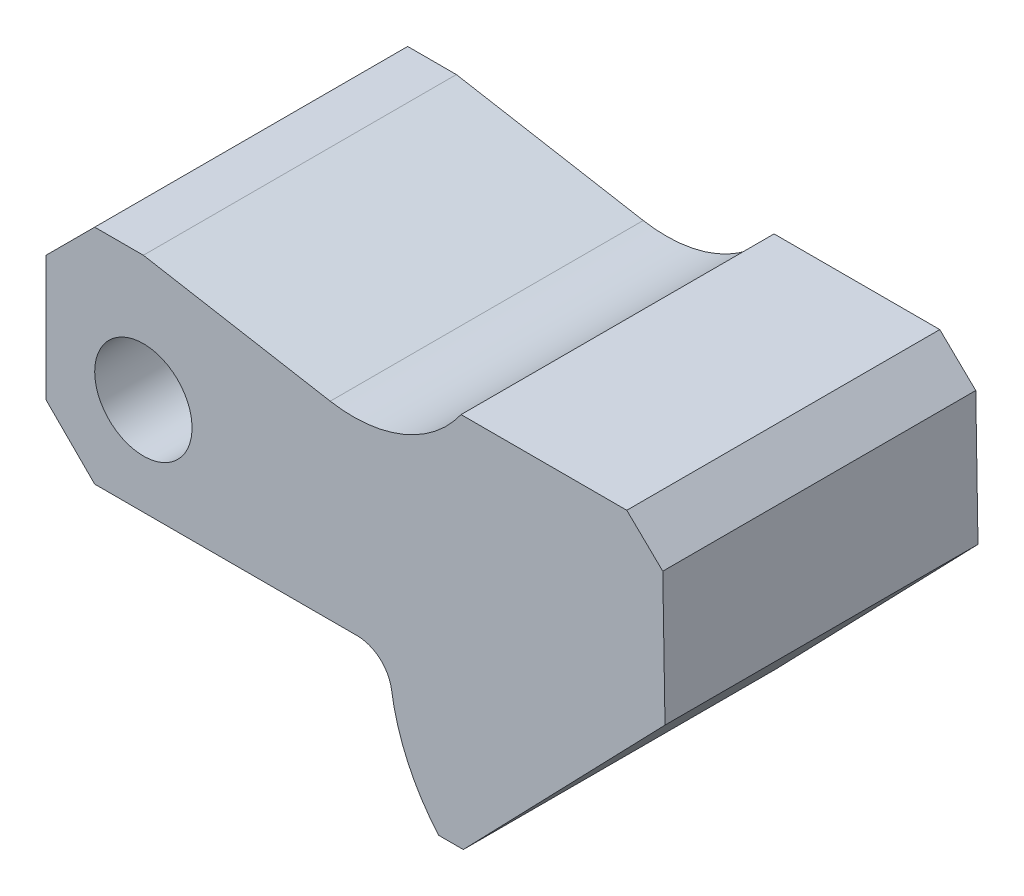
ISO-10303-21;
HEADER;
FILE_DESCRIPTION(('STEP AP214'),'2;1');
FILE_NAME('part.step','',(''),(''),'','','');
FILE_SCHEMA(('AUTOMOTIVE_DESIGN { 1 0 10303 214 1 1 1 1 }'));
ENDSEC;
DATA;
#1=APPLICATION_CONTEXT('core data for automotive mechanical design processes');
#2=APPLICATION_PROTOCOL_DEFINITION('international standard','automotive_design',2000,#1);
#3=PRODUCT_CONTEXT('',#1,'mechanical');
#4=PRODUCT('Part','Part','',(#3));
#5=PRODUCT_RELATED_PRODUCT_CATEGORY('part','',(#4));
#6=PRODUCT_DEFINITION_FORMATION('','',#4);
#7=PRODUCT_DEFINITION_CONTEXT('part definition',#1,'design');
#8=PRODUCT_DEFINITION('design','',#6,#7);
#9=PRODUCT_DEFINITION_SHAPE('','',#8);
#10=(LENGTH_UNIT() NAMED_UNIT(*) SI_UNIT(.MILLI.,.METRE.));
#11=(NAMED_UNIT(*) PLANE_ANGLE_UNIT() SI_UNIT($,.RADIAN.));
#12=(NAMED_UNIT(*) SI_UNIT($,.STERADIAN.) SOLID_ANGLE_UNIT());
#13=UNCERTAINTY_MEASURE_WITH_UNIT(LENGTH_MEASURE(1.E-05),#10,'distance_accuracy_value','');
#14=(GEOMETRIC_REPRESENTATION_CONTEXT(3) GLOBAL_UNCERTAINTY_ASSIGNED_CONTEXT((#13)) GLOBAL_UNIT_ASSIGNED_CONTEXT((#10,
#11,#12)) REPRESENTATION_CONTEXT('',''));
#15=CARTESIAN_POINT('',(0.,0.,0.));
#16=DIRECTION('',(0.,0.,1.));
#17=DIRECTION('',(1.,0.,0.));
#18=AXIS2_PLACEMENT_3D('',#15,#16,#17);
#19=CARTESIAN_POINT('',(37.7363232250662,-5.,45.));
#20=DIRECTION('',(0.,0.,1.));
#21=DIRECTION('',(1.,0.,0.));
#22=AXIS2_PLACEMENT_3D('',#19,#20,#21);
#23=PLANE('',#22);
#24=DIRECTION('',(1.,0.,0.));
#25=VECTOR('',#24,1.);
#26=CARTESIAN_POINT('',(0.,0.,45.));
#27=LINE('',#26,#25);
#28=CARTESIAN_POINT('',(0.,0.,45.));
#29=VERTEX_POINT('',#28);
#30=CARTESIAN_POINT('',(37.7363232250662,0.,45.));
#31=VERTEX_POINT('',#30);
#32=EDGE_CURVE('E222',#29,#31,#27,.T.);
#33=ORIENTED_EDGE('',*,*,#32,.T.);
#34=CARTESIAN_POINT('',(37.7363232250662,-5.,45.));
#35=DIRECTION('',(0.,0.,-1.));
#36=DIRECTION('',(1.,0.,0.));
#37=AXIS2_PLACEMENT_3D('',#34,#35,#36);
#38=CIRCLE('',#37,5.);
#39=CARTESIAN_POINT('',(42.681961966478,-4.26470588235293,45.));
#40=VERTEX_POINT('',#39);
#41=EDGE_CURVE('E122',#31,#40,#38,.T.);
#42=ORIENTED_EDGE('',*,*,#41,.T.);
#43=CARTESIAN_POINT('',(71.3666666666666,0.,45.));
#44=DIRECTION('',(0.,0.,1.));
#45=DIRECTION('',(1.,0.,0.));
#46=AXIS2_PLACEMENT_3D('',#43,#44,#45);
#47=CIRCLE('',#46,29.);
#48=CARTESIAN_POINT('',(49.45776436646,-19.,45.));
#49=VERTEX_POINT('',#48);
#50=EDGE_CURVE('E267',#40,#49,#47,.T.);
#51=ORIENTED_EDGE('',*,*,#50,.T.);
#52=DIRECTION('',(1.,0.,0.));
#53=VECTOR('',#52,1.);
#54=CARTESIAN_POINT('',(49.45776436646,-19.,45.));
#55=LINE('',#54,#53);
#56=CARTESIAN_POINT('',(53.,-19.,45.));
#57=VERTEX_POINT('',#56);
#58=EDGE_CURVE('E287',#49,#57,#55,.T.);
#59=ORIENTED_EDGE('',*,*,#58,.T.);
#60=DIRECTION('',(0.695022096847475,0.718988376049112,0.));
#61=VECTOR('',#60,1.);
#62=CARTESIAN_POINT('',(53.,-19.,45.));
#63=LINE('',#62,#61);
#64=CARTESIAN_POINT('',(82.,11.,45.));
#65=VERTEX_POINT('',#64);
#66=EDGE_CURVE('E283',#57,#65,#63,.T.);
#67=ORIENTED_EDGE('',*,*,#66,.T.);
#68=DIRECTION('',(-0.0169467185432905,0.999856394053973,0.));
#69=VECTOR('',#68,1.);
#70=CARTESIAN_POINT('',(82.,11.,45.));
#71=LINE('',#70,#69);
#72=CARTESIAN_POINT('',(81.6779661016948,30.,45.));
#73=VERTEX_POINT('',#72);
#74=EDGE_CURVE('E286',#65,#73,#71,.T.);
#75=ORIENTED_EDGE('',*,*,#74,.T.);
#76=DIRECTION('',(-0.718988376049112,0.695022096847475,0.));
#77=VECTOR('',#76,1.);
#78=CARTESIAN_POINT('',(81.6779661016948,30.,45.));
#79=LINE('',#78,#77);
#80=CARTESIAN_POINT('',(76.5055523085914,35.,45.));
#81=VERTEX_POINT('',#80);
#82=EDGE_CURVE('E291',#73,#81,#79,.T.);
#83=ORIENTED_EDGE('',*,*,#82,.T.);
#84=DIRECTION('',(-1.,0.,0.));
#85=VECTOR('',#84,1.);
#86=CARTESIAN_POINT('',(76.5055523085914,35.,45.));
#87=LINE('',#86,#85);
#88=CARTESIAN_POINT('',(52.6779661016948,35.,45.));
#89=VERTEX_POINT('',#88);
#90=EDGE_CURVE('E298',#81,#89,#87,.T.);
#91=ORIENTED_EDGE('',*,*,#90,.T.);
#92=CARTESIAN_POINT('',(37.1674426421407,45.9737715490447,45.));
#93=DIRECTION('',(0.,0.,-1.));
#94=DIRECTION('',(1.,0.,0.));
#95=AXIS2_PLACEMENT_3D('',#92,#93,#94);
#96=CIRCLE('',#95,19.);
#97=CARTESIAN_POINT('',(33.868127266469,27.2624242418127,45.));
#98=VERTEX_POINT('',#97);
#99=EDGE_CURVE('E301',#89,#98,#96,.T.);
#100=ORIENTED_EDGE('',*,*,#99,.T.);
#101=DIRECTION('',(-0.984807753012208,0.173648177666932,0.));
#102=VECTOR('',#101,1.);
#103=CARTESIAN_POINT('',(6.99999999999997,32.,45.));
#104=LINE('',#103,#102);
#105=CARTESIAN_POINT('',(6.99999999999997,32.,45.));
#106=VERTEX_POINT('',#105);
#107=EDGE_CURVE('E304',#98,#106,#104,.T.);
#108=ORIENTED_EDGE('',*,*,#107,.T.);
#109=DIRECTION('',(-1.,0.,0.));
#110=VECTOR('',#109,1.);
#111=CARTESIAN_POINT('',(0.,32.,45.));
#112=LINE('',#111,#110);
#113=CARTESIAN_POINT('',(0.,32.,45.));
#114=VERTEX_POINT('',#113);
#115=EDGE_CURVE('E159',#106,#114,#112,.T.);
#116=ORIENTED_EDGE('',*,*,#115,.T.);
#117=DIRECTION('',(-0.707106781186546,-0.707106781186549,0.));
#118=VECTOR('',#117,1.);
#119=CARTESIAN_POINT('',(-7.00000000000003,25.,45.));
#120=LINE('',#119,#118);
#121=CARTESIAN_POINT('',(-7.00000000000003,25.,45.));
#122=VERTEX_POINT('',#121);
#123=EDGE_CURVE('E153',#114,#122,#120,.T.);
#124=ORIENTED_EDGE('',*,*,#123,.T.);
#125=DIRECTION('',(0.,-1.,0.));
#126=VECTOR('',#125,1.);
#127=CARTESIAN_POINT('',(-7.00000000000003,7.,45.));
#128=LINE('',#127,#126);
#129=CARTESIAN_POINT('',(-7.00000000000003,7.,45.));
#130=VERTEX_POINT('',#129);
#131=EDGE_CURVE('E157',#122,#130,#128,.T.);
#132=ORIENTED_EDGE('',*,*,#131,.T.);
#133=DIRECTION('',(0.707106781186549,-0.707106781186546,0.));
#134=VECTOR('',#133,1.);
#135=CARTESIAN_POINT('',(0.,0.,45.));
#136=LINE('',#135,#134);
#137=EDGE_CURVE('E61',#130,#29,#136,.T.);
#138=ORIENTED_EDGE('',*,*,#137,.T.);
#139=EDGE_LOOP('',(#33,#42,#51,#59,#67,#75,#83,#91,#100,#108,#116,#124,#132,#138));
#140=FACE_BOUND('',#139,.T.);
#141=CARTESIAN_POINT('',(6.99999999999997,14.,45.));
#142=DIRECTION('',(0.,0.,1.));
#143=DIRECTION('',(1.,0.,0.));
#144=AXIS2_PLACEMENT_3D('',#141,#142,#143);
#145=CIRCLE('',#144,7.);
#146=CARTESIAN_POINT('',(0.,14.,45.));
#147=VERTEX_POINT('',#146);
#148=EDGE_CURVE('E186',#147,#147,#145,.T.);
#149=ORIENTED_EDGE('',*,*,#148,.F.);
#150=EDGE_LOOP('',(#149));
#151=FACE_BOUND('',#150,.T.);
#152=ADVANCED_FACE('F43',(#140,#151),#23,.T.);
#153=CARTESIAN_POINT('',(37.7363232250662,-5.,0.));
#154=DIRECTION('',(0.,0.,1.));
#155=DIRECTION('',(1.,0.,0.));
#156=AXIS2_PLACEMENT_3D('',#153,#154,#155);
#157=PLANE('',#156);
#158=DIRECTION('',(1.,0.,0.));
#159=VECTOR('',#158,1.);
#160=CARTESIAN_POINT('',(0.,0.,0.));
#161=LINE('',#160,#159);
#162=CARTESIAN_POINT('',(0.,0.,0.));
#163=VERTEX_POINT('',#162);
#164=CARTESIAN_POINT('',(37.7363232250662,0.,0.));
#165=VERTEX_POINT('',#164);
#166=EDGE_CURVE('E181',#163,#165,#161,.T.);
#167=ORIENTED_EDGE('',*,*,#166,.F.);
#168=DIRECTION('',(0.707106781186549,-0.707106781186546,0.));
#169=VECTOR('',#168,1.);
#170=CARTESIAN_POINT('',(0.,0.,0.));
#171=LINE('',#170,#169);
#172=CARTESIAN_POINT('',(-7.00000000000003,7.,0.));
#173=VERTEX_POINT('',#172);
#174=EDGE_CURVE('E114',#173,#163,#171,.T.);
#175=ORIENTED_EDGE('',*,*,#174,.F.);
#176=DIRECTION('',(0.,-1.,0.));
#177=VECTOR('',#176,1.);
#178=CARTESIAN_POINT('',(-7.00000000000003,7.,0.));
#179=LINE('',#178,#177);
#180=CARTESIAN_POINT('',(-7.00000000000003,25.,0.));
#181=VERTEX_POINT('',#180);
#182=EDGE_CURVE('E108',#181,#173,#179,.T.);
#183=ORIENTED_EDGE('',*,*,#182,.F.);
#184=DIRECTION('',(-0.707106781186546,-0.707106781186549,0.));
#185=VECTOR('',#184,1.);
#186=CARTESIAN_POINT('',(-7.00000000000003,25.,0.));
#187=LINE('',#186,#185);
#188=CARTESIAN_POINT('',(0.,32.,0.));
#189=VERTEX_POINT('',#188);
#190=EDGE_CURVE('E168',#189,#181,#187,.T.);
#191=ORIENTED_EDGE('',*,*,#190,.F.);
#192=DIRECTION('',(-1.,0.,0.));
#193=VECTOR('',#192,1.);
#194=CARTESIAN_POINT('',(0.,32.,0.));
#195=LINE('',#194,#193);
#196=CARTESIAN_POINT('',(6.99999999999997,32.,0.));
#197=VERTEX_POINT('',#196);
#198=EDGE_CURVE('E213',#197,#189,#195,.T.);
#199=ORIENTED_EDGE('',*,*,#198,.F.);
#200=DIRECTION('',(-0.984807753012208,0.173648177666932,0.));
#201=VECTOR('',#200,1.);
#202=CARTESIAN_POINT('',(6.99999999999997,32.,0.));
#203=LINE('',#202,#201);
#204=CARTESIAN_POINT('',(33.868127266469,27.2624242418127,0.));
#205=VERTEX_POINT('',#204);
#206=EDGE_CURVE('E210',#205,#197,#203,.T.);
#207=ORIENTED_EDGE('',*,*,#206,.F.);
#208=CARTESIAN_POINT('',(37.1674426421407,45.9737715490447,0.));
#209=DIRECTION('',(0.,0.,-1.));
#210=DIRECTION('',(1.,0.,0.));
#211=AXIS2_PLACEMENT_3D('',#208,#209,#210);
#212=CIRCLE('',#211,19.);
#213=CARTESIAN_POINT('',(52.6779661016948,35.,0.));
#214=VERTEX_POINT('',#213);
#215=EDGE_CURVE('E207',#214,#205,#212,.T.);
#216=ORIENTED_EDGE('',*,*,#215,.F.);
#217=DIRECTION('',(-1.,0.,0.));
#218=VECTOR('',#217,1.);
#219=CARTESIAN_POINT('',(76.5055523085914,35.,0.));
#220=LINE('',#219,#218);
#221=CARTESIAN_POINT('',(76.5055523085914,35.,0.));
#222=VERTEX_POINT('',#221);
#223=EDGE_CURVE('E204',#222,#214,#220,.T.);
#224=ORIENTED_EDGE('',*,*,#223,.F.);
#225=DIRECTION('',(-0.718988376049112,0.695022096847475,0.));
#226=VECTOR('',#225,1.);
#227=CARTESIAN_POINT('',(81.6779661016948,30.,0.));
#228=LINE('',#227,#226);
#229=CARTESIAN_POINT('',(81.6779661016948,30.,0.));
#230=VERTEX_POINT('',#229);
#231=EDGE_CURVE('E201',#230,#222,#228,.T.);
#232=ORIENTED_EDGE('',*,*,#231,.F.);
#233=DIRECTION('',(-0.0169467185432905,0.999856394053973,0.));
#234=VECTOR('',#233,1.);
#235=CARTESIAN_POINT('',(82.,11.,0.));
#236=LINE('',#235,#234);
#237=CARTESIAN_POINT('',(82.,11.,0.));
#238=VERTEX_POINT('',#237);
#239=EDGE_CURVE('E198',#238,#230,#236,.T.);
#240=ORIENTED_EDGE('',*,*,#239,.F.);
#241=DIRECTION('',(0.695022096847475,0.718988376049112,0.));
#242=VECTOR('',#241,1.);
#243=CARTESIAN_POINT('',(53.,-19.,0.));
#244=LINE('',#243,#242);
#245=CARTESIAN_POINT('',(53.,-19.,0.));
#246=VERTEX_POINT('',#245);
#247=EDGE_CURVE('E195',#246,#238,#244,.T.);
#248=ORIENTED_EDGE('',*,*,#247,.F.);
#249=DIRECTION('',(1.,0.,0.));
#250=VECTOR('',#249,1.);
#251=CARTESIAN_POINT('',(49.45776436646,-19.,0.));
#252=LINE('',#251,#250);
#253=CARTESIAN_POINT('',(49.45776436646,-19.,0.));
#254=VERTEX_POINT('',#253);
#255=EDGE_CURVE('E192',#254,#246,#252,.T.);
#256=ORIENTED_EDGE('',*,*,#255,.F.);
#257=CARTESIAN_POINT('',(71.3666666666666,0.,0.));
#258=DIRECTION('',(0.,0.,1.));
#259=DIRECTION('',(1.,0.,0.));
#260=AXIS2_PLACEMENT_3D('',#257,#258,#259);
#261=CIRCLE('',#260,29.);
#262=CARTESIAN_POINT('',(42.681961966478,-4.26470588235293,0.));
#263=VERTEX_POINT('',#262);
#264=EDGE_CURVE('E189',#263,#254,#261,.T.);
#265=ORIENTED_EDGE('',*,*,#264,.F.);
#266=CARTESIAN_POINT('',(37.7363232250662,-5.,0.));
#267=DIRECTION('',(0.,0.,-1.));
#268=DIRECTION('',(1.,0.,0.));
#269=AXIS2_PLACEMENT_3D('',#266,#267,#268);
#270=CIRCLE('',#269,5.);
#271=EDGE_CURVE('E185',#165,#263,#270,.T.);
#272=ORIENTED_EDGE('',*,*,#271,.F.);
#273=EDGE_LOOP('',(#167,#175,#183,#191,#199,#207,#216,#224,#232,#240,#248,#256,#265,#272));
#274=FACE_BOUND('',#273,.T.);
#275=CARTESIAN_POINT('',(6.99999999999997,14.,0.));
#276=DIRECTION('',(0.,0.,1.));
#277=DIRECTION('',(1.,0.,0.));
#278=AXIS2_PLACEMENT_3D('',#275,#276,#277);
#279=CIRCLE('',#278,7.);
#280=CARTESIAN_POINT('',(0.,14.,0.));
#281=VERTEX_POINT('',#280);
#282=EDGE_CURVE('E513',#281,#281,#279,.T.);
#283=ORIENTED_EDGE('',*,*,#282,.T.);
#284=EDGE_LOOP('',(#283));
#285=FACE_BOUND('',#284,.T.);
#286=ADVANCED_FACE('F271',(#274,#285),#157,.F.);
#287=CARTESIAN_POINT('',(0.,0.,45.));
#288=DIRECTION('',(0.,1.,0.));
#289=DIRECTION('',(0.,0.,1.));
#290=AXIS2_PLACEMENT_3D('',#287,#288,#289);
#291=PLANE('',#290);
#292=ORIENTED_EDGE('',*,*,#166,.T.);
#293=DIRECTION('',(0.,0.,-1.));
#294=VECTOR('',#293,1.);
#295=CARTESIAN_POINT('',(37.7363232250662,0.,45.));
#296=LINE('',#295,#294);
#297=EDGE_CURVE('E11',#31,#165,#296,.T.);
#298=ORIENTED_EDGE('',*,*,#297,.F.);
#299=ORIENTED_EDGE('',*,*,#32,.F.);
#300=DIRECTION('',(0.,0.,-1.));
#301=VECTOR('',#300,1.);
#302=CARTESIAN_POINT('',(0.,0.,45.));
#303=LINE('',#302,#301);
#304=EDGE_CURVE('E177',#29,#163,#303,.T.);
#305=ORIENTED_EDGE('',*,*,#304,.T.);
#306=EDGE_LOOP('',(#292,#298,#299,#305));
#307=FACE_BOUND('',#306,.T.);
#308=ADVANCED_FACE('F45',(#307),#291,.F.);
#309=CARTESIAN_POINT('',(37.7363232250662,-5.,45.));
#310=DIRECTION('',(0.,0.,-1.));
#311=DIRECTION('',(-1.,0.,0.));
#312=AXIS2_PLACEMENT_3D('',#309,#310,#311);
#313=CYLINDRICAL_SURFACE('',#312,5.);
#314=ORIENTED_EDGE('',*,*,#271,.T.);
#315=DIRECTION('',(0.,0.,-1.));
#316=VECTOR('',#315,1.);
#317=CARTESIAN_POINT('',(42.681961966478,-4.26470588235293,45.));
#318=LINE('',#317,#316);
#319=EDGE_CURVE('E53',#40,#263,#318,.T.);
#320=ORIENTED_EDGE('',*,*,#319,.F.);
#321=ORIENTED_EDGE('',*,*,#41,.F.);
#322=ORIENTED_EDGE('',*,*,#297,.T.);
#323=EDGE_LOOP('',(#314,#320,#321,#322));
#324=FACE_BOUND('',#323,.T.);
#325=ADVANCED_FACE('F340',(#324),#313,.F.);
#326=CARTESIAN_POINT('',(71.3666666666666,0.,45.));
#327=DIRECTION('',(0.,0.,-1.));
#328=DIRECTION('',(-1.,0.,0.));
#329=AXIS2_PLACEMENT_3D('',#326,#327,#328);
#330=CYLINDRICAL_SURFACE('',#329,29.);
#331=ORIENTED_EDGE('',*,*,#264,.T.);
#332=DIRECTION('',(0.,0.,-1.));
#333=VECTOR('',#332,1.);
#334=CARTESIAN_POINT('',(49.45776436646,-19.,45.));
#335=LINE('',#334,#333);
#336=EDGE_CURVE('E257',#49,#254,#335,.T.);
#337=ORIENTED_EDGE('',*,*,#336,.F.);
#338=ORIENTED_EDGE('',*,*,#50,.F.);
#339=ORIENTED_EDGE('',*,*,#319,.T.);
#340=EDGE_LOOP('',(#331,#337,#338,#339));
#341=FACE_BOUND('',#340,.T.);
#342=ADVANCED_FACE('F265',(#341),#330,.T.);
#343=CARTESIAN_POINT('',(49.45776436646,-19.,45.));
#344=DIRECTION('',(0.,1.,0.));
#345=DIRECTION('',(-1.,0.,0.));
#346=AXIS2_PLACEMENT_3D('',#343,#344,#345);
#347=PLANE('',#346);
#348=ORIENTED_EDGE('',*,*,#255,.T.);
#349=DIRECTION('',(0.,0.,-1.));
#350=VECTOR('',#349,1.);
#351=CARTESIAN_POINT('',(53.,-19.,45.));
#352=LINE('',#351,#350);
#353=EDGE_CURVE('E253',#57,#246,#352,.T.);
#354=ORIENTED_EDGE('',*,*,#353,.F.);
#355=ORIENTED_EDGE('',*,*,#58,.F.);
#356=ORIENTED_EDGE('',*,*,#336,.T.);
#357=EDGE_LOOP('',(#348,#354,#355,#356));
#358=FACE_BOUND('',#357,.T.);
#359=ADVANCED_FACE('F277',(#358),#347,.F.);
#360=CARTESIAN_POINT('',(53.,-19.,45.));
#361=DIRECTION('',(-0.718988376049112,0.695022096847475,0.));
#362=DIRECTION('',(-0.695022096847475,-0.718988376049112,0.));
#363=AXIS2_PLACEMENT_3D('',#360,#361,#362);
#364=PLANE('',#363);
#365=ORIENTED_EDGE('',*,*,#247,.T.);
#366=DIRECTION('',(0.,0.,-1.));
#367=VECTOR('',#366,1.);
#368=CARTESIAN_POINT('',(82.,11.,45.));
#369=LINE('',#368,#367);
#370=EDGE_CURVE('E249',#65,#238,#369,.T.);
#371=ORIENTED_EDGE('',*,*,#370,.F.);
#372=ORIENTED_EDGE('',*,*,#66,.F.);
#373=ORIENTED_EDGE('',*,*,#353,.T.);
#374=EDGE_LOOP('',(#365,#371,#372,#373));
#375=FACE_BOUND('',#374,.T.);
#376=ADVANCED_FACE('F281',(#375),#364,.F.);
#377=CARTESIAN_POINT('',(82.,11.,45.));
#378=DIRECTION('',(-0.999856394053973,-0.0169467185432905,0.));
#379=DIRECTION('',(0.0169467185432905,-0.999856394053973,0.));
#380=AXIS2_PLACEMENT_3D('',#377,#378,#379);
#381=PLANE('',#380);
#382=ORIENTED_EDGE('',*,*,#239,.T.);
#383=DIRECTION('',(0.,0.,-1.));
#384=VECTOR('',#383,1.);
#385=CARTESIAN_POINT('',(81.6779661016948,30.,45.));
#386=LINE('',#385,#384);
#387=EDGE_CURVE('E245',#73,#230,#386,.T.);
#388=ORIENTED_EDGE('',*,*,#387,.F.);
#389=ORIENTED_EDGE('',*,*,#74,.F.);
#390=ORIENTED_EDGE('',*,*,#370,.T.);
#391=EDGE_LOOP('',(#382,#388,#389,#390));
#392=FACE_BOUND('',#391,.T.);
#393=ADVANCED_FACE('F353',(#392),#381,.F.);
#394=CARTESIAN_POINT('',(81.6779661016948,30.,45.));
#395=DIRECTION('',(-0.695022096847475,-0.718988376049111,0.));
#396=DIRECTION('',(0.718988376049112,-0.695022096847475,0.));
#397=AXIS2_PLACEMENT_3D('',#394,#395,#396);
#398=PLANE('',#397);
#399=ORIENTED_EDGE('',*,*,#231,.T.);
#400=DIRECTION('',(0.,0.,-1.));
#401=VECTOR('',#400,1.);
#402=CARTESIAN_POINT('',(76.5055523085914,35.,45.));
#403=LINE('',#402,#401);
#404=EDGE_CURVE('E241',#81,#222,#403,.T.);
#405=ORIENTED_EDGE('',*,*,#404,.F.);
#406=ORIENTED_EDGE('',*,*,#82,.F.);
#407=ORIENTED_EDGE('',*,*,#387,.T.);
#408=EDGE_LOOP('',(#399,#405,#406,#407));
#409=FACE_BOUND('',#408,.T.);
#410=ADVANCED_FACE('F356',(#409),#398,.F.);
#411=CARTESIAN_POINT('',(76.5055523085914,35.,45.));
#412=DIRECTION('',(0.,-1.,0.));
#413=DIRECTION('',(0.,0.,-1.));
#414=AXIS2_PLACEMENT_3D('',#411,#412,#413);
#415=PLANE('',#414);
#416=ORIENTED_EDGE('',*,*,#223,.T.);
#417=DIRECTION('',(0.,0.,-1.));
#418=VECTOR('',#417,1.);
#419=CARTESIAN_POINT('',(52.6779661016948,35.,45.));
#420=LINE('',#419,#418);
#421=EDGE_CURVE('E237',#89,#214,#420,.T.);
#422=ORIENTED_EDGE('',*,*,#421,.F.);
#423=ORIENTED_EDGE('',*,*,#90,.F.);
#424=ORIENTED_EDGE('',*,*,#404,.T.);
#425=EDGE_LOOP('',(#416,#422,#423,#424));
#426=FACE_BOUND('',#425,.T.);
#427=ADVANCED_FACE('F360',(#426),#415,.F.);
#428=CARTESIAN_POINT('',(37.1674426421407,45.9737715490447,45.));
#429=DIRECTION('',(0.,0.,-1.));
#430=DIRECTION('',(-1.,0.,0.));
#431=AXIS2_PLACEMENT_3D('',#428,#429,#430);
#432=CYLINDRICAL_SURFACE('',#431,19.);
#433=ORIENTED_EDGE('',*,*,#215,.T.);
#434=DIRECTION('',(0.,0.,-1.));
#435=VECTOR('',#434,1.);
#436=CARTESIAN_POINT('',(33.868127266469,27.2624242418127,45.));
#437=LINE('',#436,#435);
#438=EDGE_CURVE('E233',#98,#205,#437,.T.);
#439=ORIENTED_EDGE('',*,*,#438,.F.);
#440=ORIENTED_EDGE('',*,*,#99,.F.);
#441=ORIENTED_EDGE('',*,*,#421,.T.);
#442=EDGE_LOOP('',(#433,#439,#440,#441));
#443=FACE_BOUND('',#442,.T.);
#444=ADVANCED_FACE('F364',(#443),#432,.F.);
#445=CARTESIAN_POINT('',(6.99999999999997,32.,45.));
#446=DIRECTION('',(-0.173648177666932,-0.984807753012208,0.));
#447=DIRECTION('',(0.984807753012208,-0.173648177666932,0.));
#448=AXIS2_PLACEMENT_3D('',#445,#446,#447);
#449=PLANE('',#448);
#450=ORIENTED_EDGE('',*,*,#206,.T.);
#451=DIRECTION('',(0.,0.,-1.));
#452=VECTOR('',#451,1.);
#453=CARTESIAN_POINT('',(6.99999999999997,32.,45.));
#454=LINE('',#453,#452);
#455=EDGE_CURVE('E229',#106,#197,#454,.T.);
#456=ORIENTED_EDGE('',*,*,#455,.F.);
#457=ORIENTED_EDGE('',*,*,#107,.F.);
#458=ORIENTED_EDGE('',*,*,#438,.T.);
#459=EDGE_LOOP('',(#450,#456,#457,#458));
#460=FACE_BOUND('',#459,.T.);
#461=ADVANCED_FACE('F312',(#460),#449,.F.);
#462=CARTESIAN_POINT('',(0.,32.,45.));
#463=DIRECTION('',(0.,-1.,0.));
#464=DIRECTION('',(1.,0.,0.));
#465=AXIS2_PLACEMENT_3D('',#462,#463,#464);
#466=PLANE('',#465);
#467=ORIENTED_EDGE('',*,*,#198,.T.);
#468=DIRECTION('',(0.,0.,-1.));
#469=VECTOR('',#468,1.);
#470=CARTESIAN_POINT('',(0.,32.,45.));
#471=LINE('',#470,#469);
#472=EDGE_CURVE('E170',#114,#189,#471,.T.);
#473=ORIENTED_EDGE('',*,*,#472,.F.);
#474=ORIENTED_EDGE('',*,*,#115,.F.);
#475=ORIENTED_EDGE('',*,*,#455,.T.);
#476=EDGE_LOOP('',(#467,#473,#474,#475));
#477=FACE_BOUND('',#476,.T.);
#478=ADVANCED_FACE('F316',(#477),#466,.F.);
#479=CARTESIAN_POINT('',(-7.00000000000003,25.,45.));
#480=DIRECTION('',(0.707106781186549,-0.707106781186546,0.));
#481=DIRECTION('',(0.707106781186546,0.707106781186549,0.));
#482=AXIS2_PLACEMENT_3D('',#479,#480,#481);
#483=PLANE('',#482);
#484=ORIENTED_EDGE('',*,*,#190,.T.);
#485=DIRECTION('',(0.,0.,-1.));
#486=VECTOR('',#485,1.);
#487=CARTESIAN_POINT('',(-7.00000000000003,25.,45.));
#488=LINE('',#487,#486);
#489=EDGE_CURVE('E165',#122,#181,#488,.T.);
#490=ORIENTED_EDGE('',*,*,#489,.F.);
#491=ORIENTED_EDGE('',*,*,#123,.F.);
#492=ORIENTED_EDGE('',*,*,#472,.T.);
#493=EDGE_LOOP('',(#484,#490,#491,#492));
#494=FACE_BOUND('',#493,.T.);
#495=ADVANCED_FACE('F166',(#494),#483,.F.);
#496=CARTESIAN_POINT('',(-7.00000000000003,7.,45.));
#497=DIRECTION('',(1.,0.,0.));
#498=DIRECTION('',(0.,0.,-1.));
#499=AXIS2_PLACEMENT_3D('',#496,#497,#498);
#500=PLANE('',#499);
#501=ORIENTED_EDGE('',*,*,#182,.T.);
#502=DIRECTION('',(0.,0.,-1.));
#503=VECTOR('',#502,1.);
#504=CARTESIAN_POINT('',(-7.00000000000003,7.,45.));
#505=LINE('',#504,#503);
#506=EDGE_CURVE('E171',#130,#173,#505,.T.);
#507=ORIENTED_EDGE('',*,*,#506,.F.);
#508=ORIENTED_EDGE('',*,*,#131,.F.);
#509=ORIENTED_EDGE('',*,*,#489,.T.);
#510=EDGE_LOOP('',(#501,#507,#508,#509));
#511=FACE_BOUND('',#510,.T.);
#512=ADVANCED_FACE('F173',(#511),#500,.F.);
#513=CARTESIAN_POINT('',(0.,0.,45.));
#514=DIRECTION('',(0.707106781186546,0.707106781186549,0.));
#515=DIRECTION('',(-0.707106781186549,0.707106781186546,0.));
#516=AXIS2_PLACEMENT_3D('',#513,#514,#515);
#517=PLANE('',#516);
#518=ORIENTED_EDGE('',*,*,#174,.T.);
#519=ORIENTED_EDGE('',*,*,#304,.F.);
#520=ORIENTED_EDGE('',*,*,#137,.F.);
#521=ORIENTED_EDGE('',*,*,#506,.T.);
#522=EDGE_LOOP('',(#518,#519,#520,#521));
#523=FACE_BOUND('',#522,.T.);
#524=ADVANCED_FACE('F320',(#523),#517,.F.);
#525=CARTESIAN_POINT('',(6.99999999999997,14.,45.));
#526=DIRECTION('',(0.,0.,-1.));
#527=DIRECTION('',(-1.,0.,0.));
#528=AXIS2_PLACEMENT_3D('',#525,#526,#527);
#529=CYLINDRICAL_SURFACE('',#528,7.);
#530=CARTESIAN_POINT('',(0.,14.,45.));
#531=CARTESIAN_POINT('',(0.,14.,44.53125));
#532=CARTESIAN_POINT('',(0.,14.,44.0625));
#533=CARTESIAN_POINT('',(0.,14.,43.125));
#534=CARTESIAN_POINT('',(0.,14.,42.65625));
#535=CARTESIAN_POINT('',(0.,14.,41.71875));
#536=CARTESIAN_POINT('',(0.,14.,41.25));
#537=CARTESIAN_POINT('',(0.,14.,40.3125));
#538=CARTESIAN_POINT('',(0.,14.,39.84375));
#539=CARTESIAN_POINT('',(0.,14.,38.90625));
#540=CARTESIAN_POINT('',(0.,14.,38.4375));
#541=CARTESIAN_POINT('',(0.,14.,37.5));
#542=CARTESIAN_POINT('',(0.,14.,37.03125));
#543=CARTESIAN_POINT('',(0.,14.,36.09375));
#544=CARTESIAN_POINT('',(0.,14.,35.625));
#545=CARTESIAN_POINT('',(0.,14.,34.6875));
#546=CARTESIAN_POINT('',(0.,14.,34.21875));
#547=CARTESIAN_POINT('',(0.,14.,33.28125));
#548=CARTESIAN_POINT('',(0.,14.,32.8125));
#549=CARTESIAN_POINT('',(0.,14.,31.875));
#550=CARTESIAN_POINT('',(0.,14.,31.40625));
#551=CARTESIAN_POINT('',(0.,14.,30.46875));
#552=CARTESIAN_POINT('',(0.,14.,30.));
#553=CARTESIAN_POINT('',(0.,14.,29.0625));
#554=CARTESIAN_POINT('',(0.,14.,28.59375));
#555=CARTESIAN_POINT('',(0.,14.,27.65625));
#556=CARTESIAN_POINT('',(0.,14.,27.1875));
#557=CARTESIAN_POINT('',(0.,14.,26.25));
#558=CARTESIAN_POINT('',(0.,14.,25.78125));
#559=CARTESIAN_POINT('',(0.,14.,24.84375));
#560=CARTESIAN_POINT('',(0.,14.,24.375));
#561=CARTESIAN_POINT('',(0.,14.,23.4375));
#562=CARTESIAN_POINT('',(0.,14.,22.96875));
#563=CARTESIAN_POINT('',(0.,14.,22.03125));
#564=CARTESIAN_POINT('',(0.,14.,21.5625));
#565=CARTESIAN_POINT('',(0.,14.,20.625));
#566=CARTESIAN_POINT('',(0.,14.,20.15625));
#567=CARTESIAN_POINT('',(0.,14.,19.21875));
#568=CARTESIAN_POINT('',(0.,14.,18.75));
#569=CARTESIAN_POINT('',(0.,14.,17.8125));
#570=CARTESIAN_POINT('',(0.,14.,17.34375));
#571=CARTESIAN_POINT('',(0.,14.,16.40625));
#572=CARTESIAN_POINT('',(0.,14.,15.9375));
#573=CARTESIAN_POINT('',(0.,14.,15.));
#574=CARTESIAN_POINT('',(0.,14.,14.53125));
#575=CARTESIAN_POINT('',(0.,14.,13.59375));
#576=CARTESIAN_POINT('',(0.,14.,13.125));
#577=CARTESIAN_POINT('',(0.,14.,12.1875));
#578=CARTESIAN_POINT('',(0.,14.,11.71875));
#579=CARTESIAN_POINT('',(0.,14.,10.78125));
#580=CARTESIAN_POINT('',(0.,14.,10.3125));
#581=CARTESIAN_POINT('',(0.,14.,9.375));
#582=CARTESIAN_POINT('',(0.,14.,8.90625));
#583=CARTESIAN_POINT('',(0.,14.,7.96874999999999));
#584=CARTESIAN_POINT('',(0.,14.,7.5));
#585=CARTESIAN_POINT('',(0.,14.,6.5625));
#586=CARTESIAN_POINT('',(0.,14.,6.09375));
#587=CARTESIAN_POINT('',(0.,14.,5.15625));
#588=CARTESIAN_POINT('',(0.,14.,4.68749999999999));
#589=CARTESIAN_POINT('',(0.,14.,3.74999999999999));
#590=CARTESIAN_POINT('',(0.,14.,3.28124999999999));
#591=CARTESIAN_POINT('',(0.,14.,2.34374999999999));
#592=CARTESIAN_POINT('',(0.,14.,1.87499999999999));
#593=CARTESIAN_POINT('',(0.,14.,0.937499999999992));
#594=CARTESIAN_POINT('',(0.,14.,0.468749999999993));
#595=CARTESIAN_POINT('',(0.,14.,0.));
#596=B_SPLINE_CURVE_WITH_KNOTS('',3,(#530,#531,#532,#533,#534,#535,#536,#537,#538,#539,#540,
#541,#542,#543,#544,#545,#546,#547,#548,#549,#550,#551,#552,#553,#554,#555,#556,#557,#558,#559,
#560,#561,#562,#563,#564,#565,#566,#567,#568,#569,#570,#571,#572,#573,#574,#575,#576,#577,#578,
#579,#580,#581,#582,#583,#584,#585,#586,#587,#588,#589,#590,#591,#592,#593,#594,#595),
.UNSPECIFIED.,.F.,.F.,(4,2,2,2,2,2,2,2,2,2,2,2,2,2,2,2,2,2,2,2,2,2,2,2,2,2,2,2,2,2,2,2,4),(0.,
1.40625,2.8125,4.21875000000001,5.62500000000001,7.03125,8.4375,9.84375000000001,11.25,12.65625,
14.0625,15.46875,16.875,18.28125,19.6875,21.09375,22.5,23.90625,25.3125,26.71875,28.125,
29.53125,30.9375,32.34375,33.75,35.15625,36.5625,37.96875,39.375,40.78125,42.1875,43.59375,45.),.UNSPECIFIED.);
#597=EDGE_CURVE('BSEAM322',#147,#281,#596,.T.);
#598=ORIENTED_EDGE('',*,*,#148,.T.);
#599=ORIENTED_EDGE('',*,*,#282,.F.);
#600=ORIENTED_EDGE('',*,*,#597,.T.);
#601=ORIENTED_EDGE('',*,*,#597,.F.);
#602=EDGE_LOOP('',(#598,#600,#599,#601));
#603=FACE_BOUND('',#602,.T.);
#604=ADVANCED_FACE('F322',(#603),#529,.F.);
#605=CLOSED_SHELL('',(#152,#286,#308,#325,#342,#359,#376,#393,#410,#427,#444,#461,#478,#495,
#512,#524,#604));
#606=MANIFOLD_SOLID_BREP('B2',#605);
#607=ADVANCED_BREP_SHAPE_REPRESENTATION('',(#18,#606),#14);
#608=SHAPE_DEFINITION_REPRESENTATION(#9,#607);
ENDSEC;
END-ISO-10303-21;
